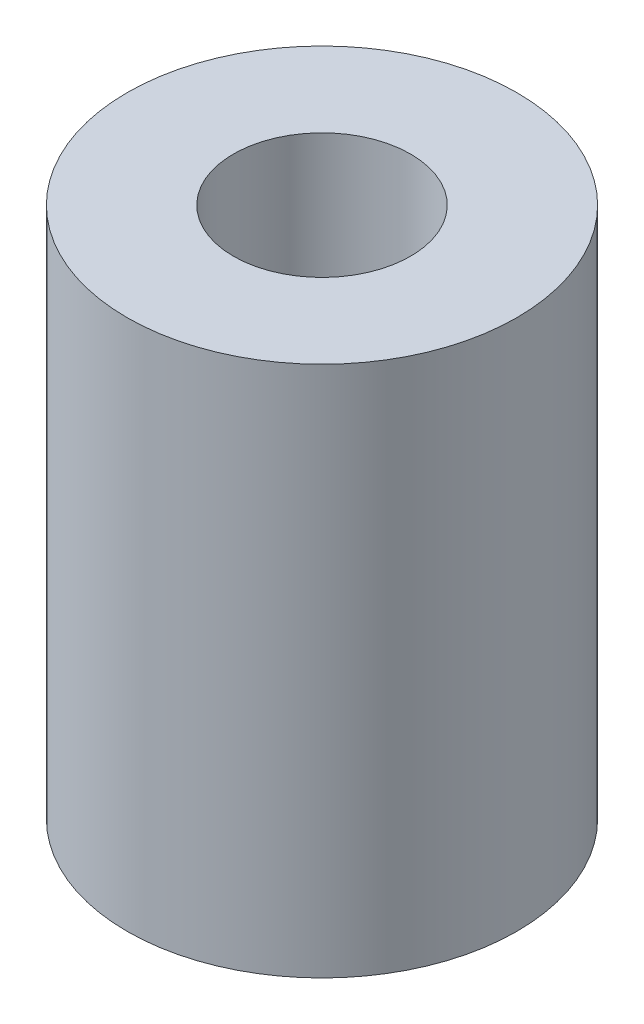
ISO-10303-21;
HEADER;
FILE_DESCRIPTION(('STEP AP214'),'2;1');
FILE_NAME('part.step','',(''),(''),'','','');
FILE_SCHEMA(('AUTOMOTIVE_DESIGN { 1 0 10303 214 1 1 1 1 }'));
ENDSEC;
DATA;
#1=APPLICATION_CONTEXT('core data for automotive mechanical design processes');
#2=APPLICATION_PROTOCOL_DEFINITION('international standard','automotive_design',2000,#1);
#3=PRODUCT_CONTEXT('',#1,'mechanical');
#4=PRODUCT('Part','Part','',(#3));
#5=PRODUCT_RELATED_PRODUCT_CATEGORY('part','',(#4));
#6=PRODUCT_DEFINITION_FORMATION('','',#4);
#7=PRODUCT_DEFINITION_CONTEXT('part definition',#1,'design');
#8=PRODUCT_DEFINITION('design','',#6,#7);
#9=PRODUCT_DEFINITION_SHAPE('','',#8);
#10=(LENGTH_UNIT() NAMED_UNIT(*) SI_UNIT(.MILLI.,.METRE.));
#11=(NAMED_UNIT(*) PLANE_ANGLE_UNIT() SI_UNIT($,.RADIAN.));
#12=(NAMED_UNIT(*) SI_UNIT($,.STERADIAN.) SOLID_ANGLE_UNIT());
#13=UNCERTAINTY_MEASURE_WITH_UNIT(LENGTH_MEASURE(1.E-05),#10,'distance_accuracy_value','');
#14=(GEOMETRIC_REPRESENTATION_CONTEXT(3) GLOBAL_UNCERTAINTY_ASSIGNED_CONTEXT((#13)) GLOBAL_UNIT_ASSIGNED_CONTEXT((#10,
#11,#12)) REPRESENTATION_CONTEXT('',''));
#15=CARTESIAN_POINT('',(0.,0.,0.));
#16=DIRECTION('',(0.,0.,1.));
#17=DIRECTION('',(1.,0.,0.));
#18=AXIS2_PLACEMENT_3D('',#15,#16,#17);
#19=CARTESIAN_POINT('',(0.,15.,0.));
#20=DIRECTION('',(0.,-1.,0.));
#21=DIRECTION('',(0.,0.,-1.));
#22=AXIS2_PLACEMENT_3D('',#19,#20,#21);
#23=CYLINDRICAL_SURFACE('',#22,2.5);
#24=CARTESIAN_POINT('',(0.,-15.,0.));
#25=DIRECTION('',(0.,-1.,0.));
#26=DIRECTION('',(0.,0.,-1.));
#27=AXIS2_PLACEMENT_3D('',#24,#25,#26);
#28=CIRCLE('',#27,2.5);
#29=CARTESIAN_POINT('',(0.,-15.,-2.5));
#30=VERTEX_POINT('',#29);
#31=EDGE_CURVE('E52',#30,#30,#28,.T.);
#32=ORIENTED_EDGE('',*,*,#31,.T.);
#33=EDGE_LOOP('',(#32));
#34=FACE_BOUND('',#33,.T.);
#35=CARTESIAN_POINT('',(0.,-5.,0.));
#36=DIRECTION('',(0.,1.,0.));
#37=DIRECTION('',(0.,0.,1.));
#38=AXIS2_PLACEMENT_3D('',#35,#36,#37);
#39=CIRCLE('',#38,2.5);
#40=CARTESIAN_POINT('',(0.,-5.,2.5));
#41=VERTEX_POINT('',#40);
#42=EDGE_CURVE('E41',#41,#41,#39,.F.);
#43=ORIENTED_EDGE('',*,*,#42,.F.);
#44=EDGE_LOOP('',(#43));
#45=FACE_BOUND('',#44,.T.);
#46=ADVANCED_FACE('F37',(#34,#45),#23,.F.);
#47=CARTESIAN_POINT('',(0.,15.,0.));
#48=DIRECTION('',(0.,-1.,0.));
#49=DIRECTION('',(0.,0.,-1.));
#50=AXIS2_PLACEMENT_3D('',#47,#48,#49);
#51=CYLINDRICAL_SURFACE('',#50,11.);
#52=CARTESIAN_POINT('',(0.,15.,0.));
#53=DIRECTION('',(0.,1.,0.));
#54=DIRECTION('',(0.,0.,1.));
#55=AXIS2_PLACEMENT_3D('',#52,#53,#54);
#56=CIRCLE('',#55,11.);
#57=CARTESIAN_POINT('',(0.,15.,11.));
#58=VERTEX_POINT('',#57);
#59=EDGE_CURVE('E10',#58,#58,#56,.T.);
#60=ORIENTED_EDGE('',*,*,#59,.F.);
#61=EDGE_LOOP('',(#60));
#62=FACE_BOUND('',#61,.T.);
#63=CARTESIAN_POINT('',(0.,-15.,0.));
#64=DIRECTION('',(0.,1.,0.));
#65=DIRECTION('',(0.,0.,1.));
#66=AXIS2_PLACEMENT_3D('',#63,#64,#65);
#67=CIRCLE('',#66,11.);
#68=CARTESIAN_POINT('',(0.,-15.,11.));
#69=VERTEX_POINT('',#68);
#70=EDGE_CURVE('E46',#69,#69,#67,.T.);
#71=ORIENTED_EDGE('',*,*,#70,.T.);
#72=EDGE_LOOP('',(#71));
#73=FACE_BOUND('',#72,.T.);
#74=ADVANCED_FACE('F39',(#62,#73),#51,.T.);
#75=CARTESIAN_POINT('',(0.,15.,0.));
#76=DIRECTION('',(0.,1.,0.));
#77=DIRECTION('',(0.,0.,1.));
#78=AXIS2_PLACEMENT_3D('',#75,#76,#77);
#79=PLANE('',#78);
#80=CARTESIAN_POINT('',(0.,15.,0.));
#81=DIRECTION('',(0.,1.,0.));
#82=DIRECTION('',(0.,0.,1.));
#83=AXIS2_PLACEMENT_3D('',#80,#81,#82);
#84=CIRCLE('',#83,5.);
#85=CARTESIAN_POINT('',(0.,15.,5.));
#86=VERTEX_POINT('',#85);
#87=EDGE_CURVE('E57',#86,#86,#84,.T.);
#88=ORIENTED_EDGE('',*,*,#87,.F.);
#89=EDGE_LOOP('',(#88));
#90=FACE_BOUND('',#89,.T.);
#91=ORIENTED_EDGE('',*,*,#59,.T.);
#92=EDGE_LOOP('',(#91));
#93=FACE_BOUND('',#92,.T.);
#94=ADVANCED_FACE('F78',(#90,#93),#79,.T.);
#95=CARTESIAN_POINT('',(0.,-15.,0.));
#96=DIRECTION('',(0.,1.,0.));
#97=DIRECTION('',(0.,0.,1.));
#98=AXIS2_PLACEMENT_3D('',#95,#96,#97);
#99=PLANE('',#98);
#100=ORIENTED_EDGE('',*,*,#31,.F.);
#101=EDGE_LOOP('',(#100));
#102=FACE_BOUND('',#101,.T.);
#103=ORIENTED_EDGE('',*,*,#70,.F.);
#104=EDGE_LOOP('',(#103));
#105=FACE_BOUND('',#104,.T.);
#106=ADVANCED_FACE('F85',(#102,#105),#99,.F.);
#107=CARTESIAN_POINT('',(0.,-5.,0.));
#108=DIRECTION('',(0.,1.,0.));
#109=DIRECTION('',(0.,0.,1.));
#110=AXIS2_PLACEMENT_3D('',#107,#108,#109);
#111=PLANE('',#110);
#112=CARTESIAN_POINT('',(0.,-5.,0.));
#113=DIRECTION('',(0.,1.,0.));
#114=DIRECTION('',(0.,0.,1.));
#115=AXIS2_PLACEMENT_3D('',#112,#113,#114);
#116=CIRCLE('',#115,5.);
#117=CARTESIAN_POINT('',(0.,-5.,5.));
#118=VERTEX_POINT('',#117);
#119=EDGE_CURVE('E61',#118,#118,#116,.T.);
#120=ORIENTED_EDGE('',*,*,#119,.T.);
#121=EDGE_LOOP('',(#120));
#122=FACE_BOUND('',#121,.T.);
#123=ORIENTED_EDGE('',*,*,#42,.T.);
#124=EDGE_LOOP('',(#123));
#125=FACE_BOUND('',#124,.T.);
#126=ADVANCED_FACE('F70',(#122,#125),#111,.T.);
#127=CARTESIAN_POINT('',(0.,-5.,0.));
#128=DIRECTION('',(0.,1.,0.));
#129=DIRECTION('',(0.,0.,1.));
#130=AXIS2_PLACEMENT_3D('',#127,#128,#129);
#131=CYLINDRICAL_SURFACE('',#130,5.);
#132=ORIENTED_EDGE('',*,*,#119,.F.);
#133=EDGE_LOOP('',(#132));
#134=FACE_BOUND('',#133,.T.);
#135=ORIENTED_EDGE('',*,*,#87,.T.);
#136=EDGE_LOOP('',(#135));
#137=FACE_BOUND('',#136,.T.);
#138=ADVANCED_FACE('F82',(#134,#137),#131,.F.);
#139=CLOSED_SHELL('',(#46,#74,#94,#106,#126,#138));
#140=MANIFOLD_SOLID_BREP('B2',#139);
#141=ADVANCED_BREP_SHAPE_REPRESENTATION('',(#18,#140),#14);
#142=SHAPE_DEFINITION_REPRESENTATION(#9,#141);
ENDSEC;
END-ISO-10303-21;
